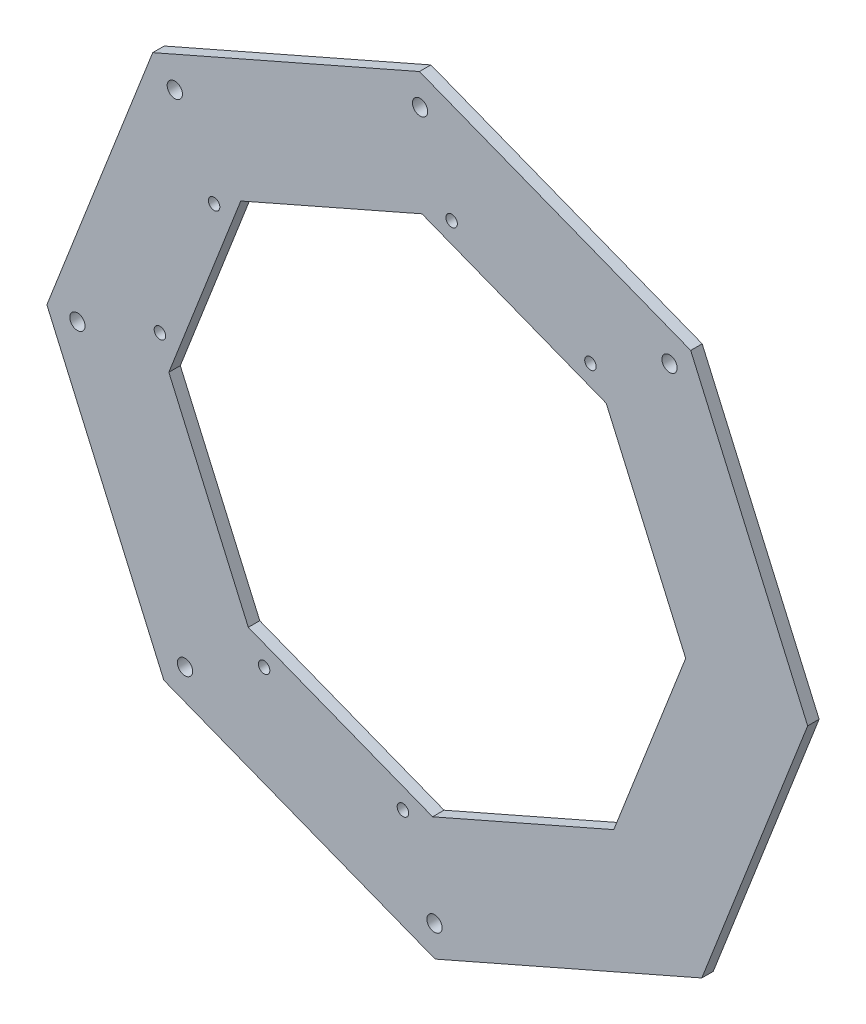
ISO-10303-21;
HEADER;
FILE_DESCRIPTION(('STEP AP214'),'2;1');
FILE_NAME('part.step','',(''),(''),'','','');
FILE_SCHEMA(('AUTOMOTIVE_DESIGN { 1 0 10303 214 1 1 1 1 }'));
ENDSEC;
DATA;
#1=APPLICATION_CONTEXT('core data for automotive mechanical design processes');
#2=APPLICATION_PROTOCOL_DEFINITION('international standard','automotive_design',2000,#1);
#3=PRODUCT_CONTEXT('',#1,'mechanical');
#4=PRODUCT('Part','Part','',(#3));
#5=PRODUCT_RELATED_PRODUCT_CATEGORY('part','',(#4));
#6=PRODUCT_DEFINITION_FORMATION('','',#4);
#7=PRODUCT_DEFINITION_CONTEXT('part definition',#1,'design');
#8=PRODUCT_DEFINITION('design','',#6,#7);
#9=PRODUCT_DEFINITION_SHAPE('','',#8);
#10=(LENGTH_UNIT() NAMED_UNIT(*) SI_UNIT(.MILLI.,.METRE.));
#11=(NAMED_UNIT(*) PLANE_ANGLE_UNIT() SI_UNIT($,.RADIAN.));
#12=(NAMED_UNIT(*) SI_UNIT($,.STERADIAN.) SOLID_ANGLE_UNIT());
#13=UNCERTAINTY_MEASURE_WITH_UNIT(LENGTH_MEASURE(1.E-05),#10,'distance_accuracy_value','');
#14=(GEOMETRIC_REPRESENTATION_CONTEXT(3) GLOBAL_UNCERTAINTY_ASSIGNED_CONTEXT((#13)) GLOBAL_UNIT_ASSIGNED_CONTEXT((#10,
#11,#12)) REPRESENTATION_CONTEXT('',''));
#15=CARTESIAN_POINT('',(0.,0.,0.));
#16=DIRECTION('',(0.,0.,1.));
#17=DIRECTION('',(1.,0.,0.));
#18=AXIS2_PLACEMENT_3D('',#15,#16,#17);
#19=CARTESIAN_POINT('',(-71.8502386018696,68.9473424361131,3.));
#20=DIRECTION('',(0.931571537654835,-0.363558069957751,0.));
#21=DIRECTION('',(0.363558069957751,0.931571537654836,0.));
#22=AXIS2_PLACEMENT_3D('',#19,#20,#21);
#23=PLANE('',#22);
#24=DIRECTION('',(-0.363558069957751,-0.931571537654835,0.));
#25=VECTOR('',#24,1.);
#26=CARTESIAN_POINT('',(-71.8502386018696,68.9473424361131,0.));
#27=LINE('',#26,#25);
#28=CARTESIAN_POINT('',(-71.8502386018696,68.9473424361131,0.));
#29=VERTEX_POINT('',#28);
#30=CARTESIAN_POINT('',(-99.5589243266201,-2.05265756388685,0.));
#31=VERTEX_POINT('',#30);
#32=EDGE_CURVE('E205',#29,#31,#27,.T.);
#33=ORIENTED_EDGE('',*,*,#32,.T.);
#34=DIRECTION('',(0.,0.,-1.));
#35=VECTOR('',#34,1.);
#36=CARTESIAN_POINT('',(-99.5589243266201,-2.05265756388685,3.));
#37=LINE('',#36,#35);
#38=CARTESIAN_POINT('',(-99.5589243266201,-2.05265756388685,3.));
#39=VERTEX_POINT('',#38);
#40=EDGE_CURVE('E11',#39,#31,#37,.T.);
#41=ORIENTED_EDGE('',*,*,#40,.F.);
#42=DIRECTION('',(-0.363558069957751,-0.931571537654835,0.));
#43=VECTOR('',#42,1.);
#44=CARTESIAN_POINT('',(-71.8502386018696,68.9473424361131,3.));
#45=LINE('',#44,#43);
#46=CARTESIAN_POINT('',(-71.8502386018696,68.9473424361131,3.));
#47=VERTEX_POINT('',#46);
#48=EDGE_CURVE('E217',#47,#39,#45,.T.);
#49=ORIENTED_EDGE('',*,*,#48,.F.);
#50=DIRECTION('',(0.,0.,-1.));
#51=VECTOR('',#50,1.);
#52=CARTESIAN_POINT('',(-71.8502386018696,68.9473424361131,3.));
#53=LINE('',#52,#51);
#54=EDGE_CURVE('E235',#47,#29,#53,.T.);
#55=ORIENTED_EDGE('',*,*,#54,.T.);
#56=EDGE_LOOP('',(#33,#41,#49,#55));
#57=FACE_BOUND('',#56,.T.);
#58=ADVANCED_FACE('F32',(#57),#23,.F.);
#59=CARTESIAN_POINT('',(-99.5589243266201,-2.05265756388685,3.));
#60=DIRECTION('',(0.915794928058333,0.401646174813894,0.));
#61=DIRECTION('',(-0.401646174813894,0.915794928058333,0.));
#62=AXIS2_PLACEMENT_3D('',#59,#60,#61);
#63=PLANE('',#62);
#64=DIRECTION('',(0.401646174813894,-0.915794928058333,0.));
#65=VECTOR('',#64,1.);
#66=CARTESIAN_POINT('',(-99.5589243266201,-2.05265756388685,0.));
#67=LINE('',#66,#65);
#68=CARTESIAN_POINT('',(-68.9473424361131,-71.8502386018696,0.));
#69=VERTEX_POINT('',#68);
#70=EDGE_CURVE('E238',#31,#69,#67,.T.);
#71=ORIENTED_EDGE('',*,*,#70,.T.);
#72=DIRECTION('',(0.,0.,-1.));
#73=VECTOR('',#72,1.);
#74=CARTESIAN_POINT('',(-68.9473424361131,-71.8502386018696,3.));
#75=LINE('',#74,#73);
#76=CARTESIAN_POINT('',(-68.9473424361131,-71.8502386018696,3.));
#77=VERTEX_POINT('',#76);
#78=EDGE_CURVE('E39',#77,#69,#75,.T.);
#79=ORIENTED_EDGE('',*,*,#78,.F.);
#80=DIRECTION('',(0.401646174813894,-0.915794928058333,0.));
#81=VECTOR('',#80,1.);
#82=CARTESIAN_POINT('',(-99.5589243266201,-2.05265756388685,3.));
#83=LINE('',#82,#81);
#84=EDGE_CURVE('E220',#39,#77,#83,.T.);
#85=ORIENTED_EDGE('',*,*,#84,.F.);
#86=ORIENTED_EDGE('',*,*,#40,.T.);
#87=EDGE_LOOP('',(#71,#79,#85,#86));
#88=FACE_BOUND('',#87,.T.);
#89=ADVANCED_FACE('F293',(#88),#63,.F.);
#90=CARTESIAN_POINT('',(-68.9473424361131,-71.8502386018696,3.));
#91=DIRECTION('',(0.363558069957751,0.931571537654836,0.));
#92=DIRECTION('',(-0.931571537654836,0.363558069957751,0.));
#93=AXIS2_PLACEMENT_3D('',#90,#91,#92);
#94=PLANE('',#93);
#95=DIRECTION('',(0.931571537654836,-0.363558069957751,0.));
#96=VECTOR('',#95,1.);
#97=CARTESIAN_POINT('',(-68.9473424361131,-71.8502386018696,0.));
#98=LINE('',#97,#96);
#99=CARTESIAN_POINT('',(2.05265756388688,-99.5589243266201,0.));
#100=VERTEX_POINT('',#99);
#101=EDGE_CURVE('E240',#69,#100,#98,.T.);
#102=ORIENTED_EDGE('',*,*,#101,.T.);
#103=DIRECTION('',(0.,0.,-1.));
#104=VECTOR('',#103,1.);
#105=CARTESIAN_POINT('',(2.05265756388688,-99.5589243266201,3.));
#106=LINE('',#105,#104);
#107=CARTESIAN_POINT('',(2.05265756388688,-99.5589243266201,3.));
#108=VERTEX_POINT('',#107);
#109=EDGE_CURVE('E265',#108,#100,#106,.T.);
#110=ORIENTED_EDGE('',*,*,#109,.F.);
#111=DIRECTION('',(0.931571537654836,-0.363558069957751,0.));
#112=VECTOR('',#111,1.);
#113=CARTESIAN_POINT('',(-68.9473424361131,-71.8502386018696,3.));
#114=LINE('',#113,#112);
#115=EDGE_CURVE('E223',#77,#108,#114,.T.);
#116=ORIENTED_EDGE('',*,*,#115,.F.);
#117=ORIENTED_EDGE('',*,*,#78,.T.);
#118=EDGE_LOOP('',(#102,#110,#116,#117));
#119=FACE_BOUND('',#118,.T.);
#120=ADVANCED_FACE('F272',(#119),#94,.F.);
#121=CARTESIAN_POINT('',(2.05265756388688,-99.5589243266201,3.));
#122=DIRECTION('',(-0.401646174813894,0.915794928058333,0.));
#123=DIRECTION('',(-0.915794928058333,-0.401646174813894,0.));
#124=AXIS2_PLACEMENT_3D('',#121,#122,#123);
#125=PLANE('',#124);
#126=DIRECTION('',(0.915794928058333,0.401646174813894,0.));
#127=VECTOR('',#126,1.);
#128=CARTESIAN_POINT('',(2.05265756388688,-99.5589243266201,0.));
#129=LINE('',#128,#127);
#130=CARTESIAN_POINT('',(71.8502386018696,-68.9473424361131,0.));
#131=VERTEX_POINT('',#130);
#132=EDGE_CURVE('E242',#100,#131,#129,.T.);
#133=ORIENTED_EDGE('',*,*,#132,.T.);
#134=DIRECTION('',(0.,0.,-1.));
#135=VECTOR('',#134,1.);
#136=CARTESIAN_POINT('',(71.8502386018696,-68.9473424361131,3.));
#137=LINE('',#136,#135);
#138=CARTESIAN_POINT('',(71.8502386018696,-68.9473424361131,3.));
#139=VERTEX_POINT('',#138);
#140=EDGE_CURVE('E262',#139,#131,#137,.T.);
#141=ORIENTED_EDGE('',*,*,#140,.F.);
#142=DIRECTION('',(0.915794928058333,0.401646174813894,0.));
#143=VECTOR('',#142,1.);
#144=CARTESIAN_POINT('',(2.05265756388688,-99.5589243266201,3.));
#145=LINE('',#144,#143);
#146=EDGE_CURVE('E225',#108,#139,#145,.T.);
#147=ORIENTED_EDGE('',*,*,#146,.F.);
#148=ORIENTED_EDGE('',*,*,#109,.T.);
#149=EDGE_LOOP('',(#133,#141,#147,#148));
#150=FACE_BOUND('',#149,.T.);
#151=ADVANCED_FACE('F281',(#150),#125,.F.);
#152=CARTESIAN_POINT('',(71.8502386018696,-68.9473424361131,3.));
#153=DIRECTION('',(-0.931571537654835,0.363558069957751,0.));
#154=DIRECTION('',(-0.363558069957752,-0.931571537654836,0.));
#155=AXIS2_PLACEMENT_3D('',#152,#153,#154);
#156=PLANE('',#155);
#157=DIRECTION('',(0.363558069957752,0.931571537654835,0.));
#158=VECTOR('',#157,1.);
#159=CARTESIAN_POINT('',(71.8502386018696,-68.9473424361131,0.));
#160=LINE('',#159,#158);
#161=CARTESIAN_POINT('',(99.55892432662,2.05265756388685,0.));
#162=VERTEX_POINT('',#161);
#163=EDGE_CURVE('E244',#131,#162,#160,.T.);
#164=ORIENTED_EDGE('',*,*,#163,.T.);
#165=DIRECTION('',(0.,0.,-1.));
#166=VECTOR('',#165,1.);
#167=CARTESIAN_POINT('',(99.55892432662,2.05265756388685,3.));
#168=LINE('',#167,#166);
#169=CARTESIAN_POINT('',(99.55892432662,2.05265756388685,3.));
#170=VERTEX_POINT('',#169);
#171=EDGE_CURVE('E259',#170,#162,#168,.T.);
#172=ORIENTED_EDGE('',*,*,#171,.F.);
#173=DIRECTION('',(0.363558069957752,0.931571537654835,0.));
#174=VECTOR('',#173,1.);
#175=CARTESIAN_POINT('',(71.8502386018696,-68.9473424361131,3.));
#176=LINE('',#175,#174);
#177=EDGE_CURVE('E227',#139,#170,#176,.T.);
#178=ORIENTED_EDGE('',*,*,#177,.F.);
#179=ORIENTED_EDGE('',*,*,#140,.T.);
#180=EDGE_LOOP('',(#164,#172,#178,#179));
#181=FACE_BOUND('',#180,.T.);
#182=ADVANCED_FACE('F285',(#181),#156,.F.);
#183=CARTESIAN_POINT('',(99.55892432662,2.05265756388685,3.));
#184=DIRECTION('',(-0.915794928058333,-0.401646174813894,0.));
#185=DIRECTION('',(0.401646174813894,-0.915794928058333,0.));
#186=AXIS2_PLACEMENT_3D('',#183,#184,#185);
#187=PLANE('',#186);
#188=DIRECTION('',(-0.401646174813894,0.915794928058333,0.));
#189=VECTOR('',#188,1.);
#190=CARTESIAN_POINT('',(99.55892432662,2.05265756388685,0.));
#191=LINE('',#190,#189);
#192=CARTESIAN_POINT('',(68.9473424361131,71.8502386018697,0.));
#193=VERTEX_POINT('',#192);
#194=EDGE_CURVE('E246',#162,#193,#191,.T.);
#195=ORIENTED_EDGE('',*,*,#194,.T.);
#196=DIRECTION('',(0.,0.,-1.));
#197=VECTOR('',#196,1.);
#198=CARTESIAN_POINT('',(68.9473424361131,71.8502386018697,3.));
#199=LINE('',#198,#197);
#200=CARTESIAN_POINT('',(68.9473424361131,71.8502386018697,3.));
#201=VERTEX_POINT('',#200);
#202=EDGE_CURVE('E256',#201,#193,#199,.T.);
#203=ORIENTED_EDGE('',*,*,#202,.F.);
#204=DIRECTION('',(-0.401646174813894,0.915794928058333,0.));
#205=VECTOR('',#204,1.);
#206=CARTESIAN_POINT('',(99.55892432662,2.05265756388685,3.));
#207=LINE('',#206,#205);
#208=EDGE_CURVE('E229',#170,#201,#207,.T.);
#209=ORIENTED_EDGE('',*,*,#208,.F.);
#210=ORIENTED_EDGE('',*,*,#171,.T.);
#211=EDGE_LOOP('',(#195,#203,#209,#210));
#212=FACE_BOUND('',#211,.T.);
#213=ADVANCED_FACE('F306',(#212),#187,.F.);
#214=CARTESIAN_POINT('',(68.9473424361131,71.8502386018697,3.));
#215=DIRECTION('',(-0.363558069957751,-0.931571537654835,0.));
#216=DIRECTION('',(0.931571537654836,-0.363558069957752,0.));
#217=AXIS2_PLACEMENT_3D('',#214,#215,#216);
#218=PLANE('',#217);
#219=DIRECTION('',(-0.931571537654835,0.363558069957752,0.));
#220=VECTOR('',#219,1.);
#221=CARTESIAN_POINT('',(68.9473424361131,71.8502386018697,0.));
#222=LINE('',#221,#220);
#223=CARTESIAN_POINT('',(-2.05265756388687,99.5589243266201,0.));
#224=VERTEX_POINT('',#223);
#225=EDGE_CURVE('E248',#193,#224,#222,.T.);
#226=ORIENTED_EDGE('',*,*,#225,.T.);
#227=DIRECTION('',(0.,0.,-1.));
#228=VECTOR('',#227,1.);
#229=CARTESIAN_POINT('',(-2.05265756388687,99.5589243266201,3.));
#230=LINE('',#229,#228);
#231=CARTESIAN_POINT('',(-2.05265756388687,99.5589243266201,3.));
#232=VERTEX_POINT('',#231);
#233=EDGE_CURVE('E253',#232,#224,#230,.T.);
#234=ORIENTED_EDGE('',*,*,#233,.F.);
#235=DIRECTION('',(-0.931571537654835,0.363558069957752,0.));
#236=VECTOR('',#235,1.);
#237=CARTESIAN_POINT('',(68.9473424361131,71.8502386018697,3.));
#238=LINE('',#237,#236);
#239=EDGE_CURVE('E231',#201,#232,#238,.T.);
#240=ORIENTED_EDGE('',*,*,#239,.F.);
#241=ORIENTED_EDGE('',*,*,#202,.T.);
#242=EDGE_LOOP('',(#226,#234,#240,#241));
#243=FACE_BOUND('',#242,.T.);
#244=ADVANCED_FACE('F304',(#243),#218,.F.);
#245=CARTESIAN_POINT('',(-2.05265756388687,99.5589243266201,3.));
#246=DIRECTION('',(0.401646174813894,-0.915794928058333,0.));
#247=DIRECTION('',(0.915794928058333,0.401646174813894,0.));
#248=AXIS2_PLACEMENT_3D('',#245,#246,#247);
#249=PLANE('',#248);
#250=DIRECTION('',(-0.915794928058333,-0.401646174813894,0.));
#251=VECTOR('',#250,1.);
#252=CARTESIAN_POINT('',(-2.05265756388687,99.5589243266201,0.));
#253=LINE('',#252,#251);
#254=EDGE_CURVE('E221',#224,#29,#253,.T.);
#255=ORIENTED_EDGE('',*,*,#254,.T.);
#256=ORIENTED_EDGE('',*,*,#54,.F.);
#257=DIRECTION('',(-0.915794928058333,-0.401646174813894,0.));
#258=VECTOR('',#257,1.);
#259=CARTESIAN_POINT('',(-2.05265756388687,99.5589243266201,3.));
#260=LINE('',#259,#258);
#261=EDGE_CURVE('E233',#232,#47,#260,.T.);
#262=ORIENTED_EDGE('',*,*,#261,.F.);
#263=ORIENTED_EDGE('',*,*,#233,.T.);
#264=EDGE_LOOP('',(#255,#256,#262,#263));
#265=FACE_BOUND('',#264,.T.);
#266=ADVANCED_FACE('F299',(#265),#249,.F.);
#267=CARTESIAN_POINT('',(0.,0.,3.));
#268=DIRECTION('',(0.,0.,1.));
#269=DIRECTION('',(1.,0.,0.));
#270=AXIS2_PLACEMENT_3D('',#267,#268,#269);
#271=PLANE('',#270);
#272=CARTESIAN_POINT('',(-66.0779807887972,63.4082956102172,3.));
#273=DIRECTION('',(0.,0.,1.));
#274=DIRECTION('',(1.,0.,0.));
#275=AXIS2_PLACEMENT_3D('',#272,#273,#274);
#276=CIRCLE('',#275,2.00000000000294);
#277=CARTESIAN_POINT('',(-64.0779807887942,63.4082956102172,3.));
#278=VERTEX_POINT('',#277);
#279=EDGE_CURVE('E574',#278,#278,#276,.T.);
#280=ORIENTED_EDGE('',*,*,#279,.F.);
#281=EDGE_LOOP('',(#280));
#282=FACE_BOUND('',#281,.T.);
#283=CARTESIAN_POINT('',(-91.5606241123375,-1.88775249340988,3.));
#284=DIRECTION('',(0.,0.,1.));
#285=DIRECTION('',(1.,0.,0.));
#286=AXIS2_PLACEMENT_3D('',#283,#284,#285);
#287=CIRCLE('',#286,2.00000000000575);
#288=CARTESIAN_POINT('',(-89.5606241123317,-1.88775249340988,3.));
#289=VERTEX_POINT('',#288);
#290=EDGE_CURVE('E576',#289,#289,#287,.T.);
#291=ORIENTED_EDGE('',*,*,#290,.F.);
#292=EDGE_LOOP('',(#291));
#293=FACE_BOUND('',#292,.T.);
#294=CARTESIAN_POINT('',(-63.4082956102132,-66.077980788801,3.));
#295=DIRECTION('',(0.,0.,1.));
#296=DIRECTION('',(1.,0.,0.));
#297=AXIS2_PLACEMENT_3D('',#294,#295,#296);
#298=CIRCLE('',#297,2.00000000000794);
#299=CARTESIAN_POINT('',(-61.4082956102053,-66.077980788801,3.));
#300=VERTEX_POINT('',#299);
#301=EDGE_CURVE('E582',#300,#300,#298,.T.);
#302=ORIENTED_EDGE('',*,*,#301,.F.);
#303=EDGE_LOOP('',(#302));
#304=FACE_BOUND('',#303,.T.);
#305=CARTESIAN_POINT('',(1.88775249341385,-91.5606241123413,3.));
#306=DIRECTION('',(0.,0.,1.));
#307=DIRECTION('',(1.,0.,0.));
#308=AXIS2_PLACEMENT_3D('',#305,#306,#307);
#309=CIRCLE('',#308,2.00000000000815);
#310=CARTESIAN_POINT('',(3.887752493422,-91.5606241123413,3.));
#311=VERTEX_POINT('',#310);
#312=EDGE_CURVE('E588',#311,#311,#309,.T.);
#313=ORIENTED_EDGE('',*,*,#312,.F.);
#314=EDGE_LOOP('',(#313));
#315=FACE_BOUND('',#314,.T.);
#316=CARTESIAN_POINT('',(63.408295610221,66.0779807888012,3.));
#317=DIRECTION('',(0.,0.,1.));
#318=DIRECTION('',(1.,0.,0.));
#319=AXIS2_PLACEMENT_3D('',#316,#317,#318);
#320=CIRCLE('',#319,2.00000000000049);
#321=CARTESIAN_POINT('',(65.4082956102215,66.0779807888012,3.));
#322=VERTEX_POINT('',#321);
#323=EDGE_CURVE('E594',#322,#322,#320,.T.);
#324=ORIENTED_EDGE('',*,*,#323,.F.);
#325=EDGE_LOOP('',(#324));
#326=FACE_BOUND('',#325,.T.);
#327=CARTESIAN_POINT('',(-1.88775249340604,91.5606241123414,3.));
#328=DIRECTION('',(0.,0.,1.));
#329=DIRECTION('',(1.,0.,0.));
#330=AXIS2_PLACEMENT_3D('',#327,#328,#329);
#331=CIRCLE('',#330,2.);
#332=CARTESIAN_POINT('',(0.112247506593964,91.5606241123414,3.));
#333=VERTEX_POINT('',#332);
#334=EDGE_CURVE('E600',#333,#333,#331,.T.);
#335=ORIENTED_EDGE('',*,*,#334,.F.);
#336=EDGE_LOOP('',(#335));
#337=FACE_BOUND('',#336,.T.);
#338=CARTESIAN_POINT('',(-55.7916964275254,42.7058147064172,3.));
#339=DIRECTION('',(0.,0.,1.));
#340=DIRECTION('',(-1.,0.,0.));
#341=AXIS2_PLACEMENT_3D('',#338,#339,#340);
#342=CIRCLE('',#341,1.5);
#343=CARTESIAN_POINT('',(-57.2916964275254,42.7058147064172,3.));
#344=VERTEX_POINT('',#343);
#345=EDGE_CURVE('E606',#344,#344,#342,.T.);
#346=ORIENTED_EDGE('',*,*,#345,.F.);
#347=EDGE_LOOP('',(#346));
#348=FACE_BOUND('',#347,.T.);
#349=CARTESIAN_POINT('',(-69.9704611558775,6.37452473787853,3.));
#350=DIRECTION('',(0.,0.,1.));
#351=DIRECTION('',(1.,0.,0.));
#352=AXIS2_PLACEMENT_3D('',#349,#350,#351);
#353=CIRCLE('',#352,1.5);
#354=CARTESIAN_POINT('',(-68.4704611558775,6.37452473787853,3.));
#355=VERTEX_POINT('',#354);
#356=EDGE_CURVE('E612',#355,#355,#353,.T.);
#357=ORIENTED_EDGE('',*,*,#356,.F.);
#358=EDGE_LOOP('',(#357));
#359=FACE_BOUND('',#358,.T.);
#360=CARTESIAN_POINT('',(-42.7058147064178,-55.791696427525,3.));
#361=DIRECTION('',(0.,0.,1.));
#362=DIRECTION('',(-1.,0.,0.));
#363=AXIS2_PLACEMENT_3D('',#360,#361,#362);
#364=CIRCLE('',#363,1.5);
#365=CARTESIAN_POINT('',(-44.2058147064178,-55.791696427525,3.));
#366=VERTEX_POINT('',#365);
#367=EDGE_CURVE('E618',#366,#366,#364,.T.);
#368=ORIENTED_EDGE('',*,*,#367,.F.);
#369=EDGE_LOOP('',(#368));
#370=FACE_BOUND('',#369,.T.);
#371=CARTESIAN_POINT('',(-6.37452473787934,-69.9704611558775,3.));
#372=DIRECTION('',(0.,0.,1.));
#373=DIRECTION('',(1.,0.,0.));
#374=AXIS2_PLACEMENT_3D('',#371,#372,#373);
#375=CIRCLE('',#374,1.5);
#376=CARTESIAN_POINT('',(-4.87452473787934,-69.9704611558775,3.));
#377=VERTEX_POINT('',#376);
#378=EDGE_CURVE('E624',#377,#377,#375,.T.);
#379=ORIENTED_EDGE('',*,*,#378,.F.);
#380=EDGE_LOOP('',(#379));
#381=FACE_BOUND('',#380,.T.);
#382=CARTESIAN_POINT('',(42.7058147064172,55.7916964275254,3.));
#383=DIRECTION('',(0.,0.,1.));
#384=DIRECTION('',(-1.,0.,0.));
#385=AXIS2_PLACEMENT_3D('',#382,#383,#384);
#386=CIRCLE('',#385,1.5);
#387=CARTESIAN_POINT('',(41.2058147064172,55.7916964275254,3.));
#388=VERTEX_POINT('',#387);
#389=EDGE_CURVE('E630',#388,#388,#386,.T.);
#390=ORIENTED_EDGE('',*,*,#389,.F.);
#391=EDGE_LOOP('',(#390));
#392=FACE_BOUND('',#391,.T.);
#393=CARTESIAN_POINT('',(6.37452473787854,69.9704611558775,3.));
#394=DIRECTION('',(0.,0.,1.));
#395=DIRECTION('',(1.,0.,0.));
#396=AXIS2_PLACEMENT_3D('',#393,#394,#395);
#397=CIRCLE('',#396,1.5);
#398=CARTESIAN_POINT('',(7.87452473787854,69.9704611558775,3.));
#399=VERTEX_POINT('',#398);
#400=EDGE_CURVE('E169',#399,#399,#397,.T.);
#401=ORIENTED_EDGE('',*,*,#400,.F.);
#402=EDGE_LOOP('',(#401));
#403=FACE_BOUND('',#402,.T.);
#404=DIRECTION('',(-0.363558069957747,-0.931571537654838,0.));
#405=VECTOR('',#404,1.);
#406=CARTESIAN_POINT('',(-48.8113033980095,46.8392271984462,3.));
#407=LINE('',#406,#405);
#408=CARTESIAN_POINT('',(-48.8113033980095,46.8392271984462,3.));
#409=VERTEX_POINT('',#408);
#410=CARTESIAN_POINT('',(-67.6351388088451,-1.39446845372782,3.));
#411=VERTEX_POINT('',#410);
#412=EDGE_CURVE('E46',#409,#411,#407,.T.);
#413=ORIENTED_EDGE('',*,*,#412,.F.);
#414=DIRECTION('',(-0.915794928058331,-0.401646174813899,0.));
#415=VECTOR('',#414,1.);
#416=CARTESIAN_POINT('',(-1.39446845372784,67.6351388088452,3.));
#417=LINE('',#416,#415);
#418=CARTESIAN_POINT('',(-1.39446845372784,67.6351388088452,3.));
#419=VERTEX_POINT('',#418);
#420=EDGE_CURVE('E163',#419,#409,#417,.T.);
#421=ORIENTED_EDGE('',*,*,#420,.F.);
#422=DIRECTION('',(-0.931571537654837,0.363558069957747,0.));
#423=VECTOR('',#422,1.);
#424=CARTESIAN_POINT('',(46.8392271984462,48.8113033980095,3.));
#425=LINE('',#424,#423);
#426=CARTESIAN_POINT('',(46.8392271984462,48.8113033980095,3.));
#427=VERTEX_POINT('',#426);
#428=EDGE_CURVE('E166',#427,#419,#425,.T.);
#429=ORIENTED_EDGE('',*,*,#428,.F.);
#430=DIRECTION('',(-0.401646174813899,0.915794928058331,0.));
#431=VECTOR('',#430,1.);
#432=CARTESIAN_POINT('',(67.6351388088451,1.39446845372784,3.));
#433=LINE('',#432,#431);
#434=CARTESIAN_POINT('',(67.6351388088451,1.39446845372784,3.));
#435=VERTEX_POINT('',#434);
#436=EDGE_CURVE('E198',#435,#427,#433,.T.);
#437=ORIENTED_EDGE('',*,*,#436,.F.);
#438=DIRECTION('',(0.363558069957747,0.931571537654838,0.));
#439=VECTOR('',#438,1.);
#440=CARTESIAN_POINT('',(48.8113033980095,-46.8392271984462,3.));
#441=LINE('',#440,#439);
#442=CARTESIAN_POINT('',(48.8113033980095,-46.8392271984462,3.));
#443=VERTEX_POINT('',#442);
#444=EDGE_CURVE('E195',#443,#435,#441,.T.);
#445=ORIENTED_EDGE('',*,*,#444,.F.);
#446=DIRECTION('',(0.915794928058331,0.401646174813898,0.));
#447=VECTOR('',#446,1.);
#448=CARTESIAN_POINT('',(1.39446845372784,-67.6351388088451,3.));
#449=LINE('',#448,#447);
#450=CARTESIAN_POINT('',(1.39446845372784,-67.6351388088451,3.));
#451=VERTEX_POINT('',#450);
#452=EDGE_CURVE('E192',#451,#443,#449,.T.);
#453=ORIENTED_EDGE('',*,*,#452,.F.);
#454=DIRECTION('',(0.931571537654837,-0.363558069957747,0.));
#455=VECTOR('',#454,1.);
#456=CARTESIAN_POINT('',(-46.8392271984462,-48.8113033980095,3.));
#457=LINE('',#456,#455);
#458=CARTESIAN_POINT('',(-46.8392271984462,-48.8113033980095,3.));
#459=VERTEX_POINT('',#458);
#460=EDGE_CURVE('E189',#459,#451,#457,.T.);
#461=ORIENTED_EDGE('',*,*,#460,.F.);
#462=DIRECTION('',(0.401646174813898,-0.915794928058331,0.));
#463=VECTOR('',#462,1.);
#464=CARTESIAN_POINT('',(-67.6351388088451,-1.39446845372782,3.));
#465=LINE('',#464,#463);
#466=EDGE_CURVE('E186',#411,#459,#465,.T.);
#467=ORIENTED_EDGE('',*,*,#466,.F.);
#468=EDGE_LOOP('',(#413,#421,#429,#437,#445,#453,#461,#467));
#469=FACE_BOUND('',#468,.T.);
#470=ORIENTED_EDGE('',*,*,#48,.T.);
#471=ORIENTED_EDGE('',*,*,#84,.T.);
#472=ORIENTED_EDGE('',*,*,#115,.T.);
#473=ORIENTED_EDGE('',*,*,#146,.T.);
#474=ORIENTED_EDGE('',*,*,#177,.T.);
#475=ORIENTED_EDGE('',*,*,#208,.T.);
#476=ORIENTED_EDGE('',*,*,#239,.T.);
#477=ORIENTED_EDGE('',*,*,#261,.T.);
#478=EDGE_LOOP('',(#470,#471,#472,#473,#474,#475,#476,#477));
#479=FACE_BOUND('',#478,.T.);
#480=ADVANCED_FACE('F289',(#282,#293,#304,#315,#326,#337,#348,#359,#370,#381,#392,#403,#469,
#479),#271,.T.);
#481=CARTESIAN_POINT('',(0.,0.,0.));
#482=DIRECTION('',(0.,0.,1.));
#483=DIRECTION('',(1.,0.,0.));
#484=AXIS2_PLACEMENT_3D('',#481,#482,#483);
#485=PLANE('',#484);
#486=CARTESIAN_POINT('',(-66.0779807887972,63.4082956102172,0.));
#487=DIRECTION('',(0.,0.,1.));
#488=DIRECTION('',(1.,0.,0.));
#489=AXIS2_PLACEMENT_3D('',#486,#487,#488);
#490=CIRCLE('',#489,2.00000000000294);
#491=CARTESIAN_POINT('',(-64.0779807887942,63.4082956102172,0.));
#492=VERTEX_POINT('',#491);
#493=EDGE_CURVE('E571',#492,#492,#490,.T.);
#494=ORIENTED_EDGE('',*,*,#493,.T.);
#495=EDGE_LOOP('',(#494));
#496=FACE_BOUND('',#495,.T.);
#497=CARTESIAN_POINT('',(-91.5606241123375,-1.88775249340988,0.));
#498=DIRECTION('',(0.,0.,1.));
#499=DIRECTION('',(1.,0.,0.));
#500=AXIS2_PLACEMENT_3D('',#497,#498,#499);
#501=CIRCLE('',#500,2.00000000000575);
#502=CARTESIAN_POINT('',(-89.5606241123317,-1.88775249340988,0.));
#503=VERTEX_POINT('',#502);
#504=EDGE_CURVE('E579',#503,#503,#501,.T.);
#505=ORIENTED_EDGE('',*,*,#504,.T.);
#506=EDGE_LOOP('',(#505));
#507=FACE_BOUND('',#506,.T.);
#508=CARTESIAN_POINT('',(-63.4082956102132,-66.077980788801,0.));
#509=DIRECTION('',(0.,0.,1.));
#510=DIRECTION('',(1.,0.,0.));
#511=AXIS2_PLACEMENT_3D('',#508,#509,#510);
#512=CIRCLE('',#511,2.00000000000794);
#513=CARTESIAN_POINT('',(-61.4082956102053,-66.077980788801,0.));
#514=VERTEX_POINT('',#513);
#515=EDGE_CURVE('E585',#514,#514,#512,.T.);
#516=ORIENTED_EDGE('',*,*,#515,.T.);
#517=EDGE_LOOP('',(#516));
#518=FACE_BOUND('',#517,.T.);
#519=CARTESIAN_POINT('',(1.88775249341385,-91.5606241123413,0.));
#520=DIRECTION('',(0.,0.,1.));
#521=DIRECTION('',(1.,0.,0.));
#522=AXIS2_PLACEMENT_3D('',#519,#520,#521);
#523=CIRCLE('',#522,2.00000000000815);
#524=CARTESIAN_POINT('',(3.887752493422,-91.5606241123413,0.));
#525=VERTEX_POINT('',#524);
#526=EDGE_CURVE('E591',#525,#525,#523,.T.);
#527=ORIENTED_EDGE('',*,*,#526,.T.);
#528=EDGE_LOOP('',(#527));
#529=FACE_BOUND('',#528,.T.);
#530=CARTESIAN_POINT('',(63.408295610221,66.0779807888012,0.));
#531=DIRECTION('',(0.,0.,1.));
#532=DIRECTION('',(1.,0.,0.));
#533=AXIS2_PLACEMENT_3D('',#530,#531,#532);
#534=CIRCLE('',#533,2.00000000000049);
#535=CARTESIAN_POINT('',(65.4082956102215,66.0779807888012,0.));
#536=VERTEX_POINT('',#535);
#537=EDGE_CURVE('E597',#536,#536,#534,.T.);
#538=ORIENTED_EDGE('',*,*,#537,.T.);
#539=EDGE_LOOP('',(#538));
#540=FACE_BOUND('',#539,.T.);
#541=CARTESIAN_POINT('',(-1.88775249340604,91.5606241123414,0.));
#542=DIRECTION('',(0.,0.,1.));
#543=DIRECTION('',(1.,0.,0.));
#544=AXIS2_PLACEMENT_3D('',#541,#542,#543);
#545=CIRCLE('',#544,2.);
#546=CARTESIAN_POINT('',(0.112247506593964,91.5606241123414,0.));
#547=VERTEX_POINT('',#546);
#548=EDGE_CURVE('E603',#547,#547,#545,.T.);
#549=ORIENTED_EDGE('',*,*,#548,.T.);
#550=EDGE_LOOP('',(#549));
#551=FACE_BOUND('',#550,.T.);
#552=CARTESIAN_POINT('',(-55.7916964275254,42.7058147064172,0.));
#553=DIRECTION('',(0.,0.,1.));
#554=DIRECTION('',(-1.,0.,0.));
#555=AXIS2_PLACEMENT_3D('',#552,#553,#554);
#556=CIRCLE('',#555,1.5);
#557=CARTESIAN_POINT('',(-57.2916964275254,42.7058147064172,0.));
#558=VERTEX_POINT('',#557);
#559=EDGE_CURVE('E609',#558,#558,#556,.T.);
#560=ORIENTED_EDGE('',*,*,#559,.T.);
#561=EDGE_LOOP('',(#560));
#562=FACE_BOUND('',#561,.T.);
#563=CARTESIAN_POINT('',(-69.9704611558775,6.37452473787853,0.));
#564=DIRECTION('',(0.,0.,1.));
#565=DIRECTION('',(1.,0.,0.));
#566=AXIS2_PLACEMENT_3D('',#563,#564,#565);
#567=CIRCLE('',#566,1.5);
#568=CARTESIAN_POINT('',(-68.4704611558775,6.37452473787853,0.));
#569=VERTEX_POINT('',#568);
#570=EDGE_CURVE('E615',#569,#569,#567,.T.);
#571=ORIENTED_EDGE('',*,*,#570,.T.);
#572=EDGE_LOOP('',(#571));
#573=FACE_BOUND('',#572,.T.);
#574=CARTESIAN_POINT('',(-42.7058147064178,-55.791696427525,0.));
#575=DIRECTION('',(0.,0.,1.));
#576=DIRECTION('',(-1.,0.,0.));
#577=AXIS2_PLACEMENT_3D('',#574,#575,#576);
#578=CIRCLE('',#577,1.5);
#579=CARTESIAN_POINT('',(-44.2058147064178,-55.791696427525,0.));
#580=VERTEX_POINT('',#579);
#581=EDGE_CURVE('E621',#580,#580,#578,.T.);
#582=ORIENTED_EDGE('',*,*,#581,.T.);
#583=EDGE_LOOP('',(#582));
#584=FACE_BOUND('',#583,.T.);
#585=CARTESIAN_POINT('',(-6.37452473787934,-69.9704611558775,0.));
#586=DIRECTION('',(0.,0.,1.));
#587=DIRECTION('',(1.,0.,0.));
#588=AXIS2_PLACEMENT_3D('',#585,#586,#587);
#589=CIRCLE('',#588,1.5);
#590=CARTESIAN_POINT('',(-4.87452473787934,-69.9704611558775,0.));
#591=VERTEX_POINT('',#590);
#592=EDGE_CURVE('E627',#591,#591,#589,.T.);
#593=ORIENTED_EDGE('',*,*,#592,.T.);
#594=EDGE_LOOP('',(#593));
#595=FACE_BOUND('',#594,.T.);
#596=CARTESIAN_POINT('',(42.7058147064172,55.7916964275254,0.));
#597=DIRECTION('',(0.,0.,1.));
#598=DIRECTION('',(-1.,0.,0.));
#599=AXIS2_PLACEMENT_3D('',#596,#597,#598);
#600=CIRCLE('',#599,1.5);
#601=CARTESIAN_POINT('',(41.2058147064172,55.7916964275254,0.));
#602=VERTEX_POINT('',#601);
#603=EDGE_CURVE('E633',#602,#602,#600,.T.);
#604=ORIENTED_EDGE('',*,*,#603,.T.);
#605=EDGE_LOOP('',(#604));
#606=FACE_BOUND('',#605,.T.);
#607=CARTESIAN_POINT('',(6.37452473787854,69.9704611558775,0.));
#608=DIRECTION('',(0.,0.,1.));
#609=DIRECTION('',(1.,0.,0.));
#610=AXIS2_PLACEMENT_3D('',#607,#608,#609);
#611=CIRCLE('',#610,1.5);
#612=CARTESIAN_POINT('',(7.87452473787854,69.9704611558775,0.));
#613=VERTEX_POINT('',#612);
#614=EDGE_CURVE('E187',#613,#613,#611,.T.);
#615=ORIENTED_EDGE('',*,*,#614,.T.);
#616=EDGE_LOOP('',(#615));
#617=FACE_BOUND('',#616,.T.);
#618=DIRECTION('',(-0.915794928058331,-0.401646174813899,0.));
#619=VECTOR('',#618,1.);
#620=CARTESIAN_POINT('',(-1.39446845372784,67.6351388088452,0.));
#621=LINE('',#620,#619);
#622=CARTESIAN_POINT('',(-1.39446845372784,67.6351388088452,0.));
#623=VERTEX_POINT('',#622);
#624=CARTESIAN_POINT('',(-48.8113033980095,46.8392271984462,0.));
#625=VERTEX_POINT('',#624);
#626=EDGE_CURVE('E152',#623,#625,#621,.T.);
#627=ORIENTED_EDGE('',*,*,#626,.T.);
#628=DIRECTION('',(-0.363558069957747,-0.931571537654838,0.));
#629=VECTOR('',#628,1.);
#630=CARTESIAN_POINT('',(-48.8113033980095,46.8392271984462,0.));
#631=LINE('',#630,#629);
#632=CARTESIAN_POINT('',(-67.6351388088451,-1.39446845372782,0.));
#633=VERTEX_POINT('',#632);
#634=EDGE_CURVE('E146',#625,#633,#631,.T.);
#635=ORIENTED_EDGE('',*,*,#634,.T.);
#636=DIRECTION('',(0.401646174813898,-0.915794928058331,0.));
#637=VECTOR('',#636,1.);
#638=CARTESIAN_POINT('',(-67.6351388088451,-1.39446845372782,0.));
#639=LINE('',#638,#637);
#640=CARTESIAN_POINT('',(-46.8392271984462,-48.8113033980095,0.));
#641=VERTEX_POINT('',#640);
#642=EDGE_CURVE('E155',#633,#641,#639,.T.);
#643=ORIENTED_EDGE('',*,*,#642,.T.);
#644=DIRECTION('',(0.931571537654837,-0.363558069957747,0.));
#645=VECTOR('',#644,1.);
#646=CARTESIAN_POINT('',(-46.8392271984462,-48.8113033980095,0.));
#647=LINE('',#646,#645);
#648=CARTESIAN_POINT('',(1.39446845372784,-67.6351388088451,0.));
#649=VERTEX_POINT('',#648);
#650=EDGE_CURVE('E54',#641,#649,#647,.T.);
#651=ORIENTED_EDGE('',*,*,#650,.T.);
#652=DIRECTION('',(0.915794928058331,0.401646174813898,0.));
#653=VECTOR('',#652,1.);
#654=CARTESIAN_POINT('',(1.39446845372784,-67.6351388088451,0.));
#655=LINE('',#654,#653);
#656=CARTESIAN_POINT('',(48.8113033980095,-46.8392271984462,0.));
#657=VERTEX_POINT('',#656);
#658=EDGE_CURVE('E173',#649,#657,#655,.T.);
#659=ORIENTED_EDGE('',*,*,#658,.T.);
#660=DIRECTION('',(0.363558069957747,0.931571537654838,0.));
#661=VECTOR('',#660,1.);
#662=CARTESIAN_POINT('',(48.8113033980095,-46.8392271984462,0.));
#663=LINE('',#662,#661);
#664=CARTESIAN_POINT('',(67.6351388088451,1.39446845372784,0.));
#665=VERTEX_POINT('',#664);
#666=EDGE_CURVE('E176',#657,#665,#663,.T.);
#667=ORIENTED_EDGE('',*,*,#666,.T.);
#668=DIRECTION('',(-0.401646174813899,0.915794928058331,0.));
#669=VECTOR('',#668,1.);
#670=CARTESIAN_POINT('',(67.6351388088451,1.39446845372784,0.));
#671=LINE('',#670,#669);
#672=CARTESIAN_POINT('',(46.8392271984462,48.8113033980095,0.));
#673=VERTEX_POINT('',#672);
#674=EDGE_CURVE('E179',#665,#673,#671,.T.);
#675=ORIENTED_EDGE('',*,*,#674,.T.);
#676=DIRECTION('',(-0.931571537654837,0.363558069957747,0.));
#677=VECTOR('',#676,1.);
#678=CARTESIAN_POINT('',(46.8392271984462,48.8113033980095,0.));
#679=LINE('',#678,#677);
#680=EDGE_CURVE('E182',#673,#623,#679,.T.);
#681=ORIENTED_EDGE('',*,*,#680,.T.);
#682=EDGE_LOOP('',(#627,#635,#643,#651,#659,#667,#675,#681));
#683=FACE_BOUND('',#682,.T.);
#684=ORIENTED_EDGE('',*,*,#32,.F.);
#685=ORIENTED_EDGE('',*,*,#254,.F.);
#686=ORIENTED_EDGE('',*,*,#225,.F.);
#687=ORIENTED_EDGE('',*,*,#194,.F.);
#688=ORIENTED_EDGE('',*,*,#163,.F.);
#689=ORIENTED_EDGE('',*,*,#132,.F.);
#690=ORIENTED_EDGE('',*,*,#101,.F.);
#691=ORIENTED_EDGE('',*,*,#70,.F.);
#692=EDGE_LOOP('',(#684,#685,#686,#687,#688,#689,#690,#691));
#693=FACE_BOUND('',#692,.T.);
#694=ADVANCED_FACE('F159',(#496,#507,#518,#529,#540,#551,#562,#573,#584,#595,#606,#617,#683,
#693),#485,.F.);
#695=CARTESIAN_POINT('',(-48.8113033980095,46.8392271984462,0.));
#696=DIRECTION('',(-0.931571537654837,0.363558069957746,0.));
#697=DIRECTION('',(-0.363558069957747,-0.931571537654838,0.));
#698=AXIS2_PLACEMENT_3D('',#695,#696,#697);
#699=PLANE('',#698);
#700=ORIENTED_EDGE('',*,*,#412,.T.);
#701=DIRECTION('',(0.,0.,1.));
#702=VECTOR('',#701,1.);
#703=CARTESIAN_POINT('',(-67.6351388088451,-1.39446845372782,0.));
#704=LINE('',#703,#702);
#705=EDGE_CURVE('E142',#633,#411,#704,.T.);
#706=ORIENTED_EDGE('',*,*,#705,.F.);
#707=ORIENTED_EDGE('',*,*,#634,.F.);
#708=DIRECTION('',(0.,0.,1.));
#709=VECTOR('',#708,1.);
#710=CARTESIAN_POINT('',(-48.8113033980095,46.8392271984462,0.));
#711=LINE('',#710,#709);
#712=EDGE_CURVE('E203',#625,#409,#711,.T.);
#713=ORIENTED_EDGE('',*,*,#712,.T.);
#714=EDGE_LOOP('',(#700,#706,#707,#713));
#715=FACE_BOUND('',#714,.T.);
#716=ADVANCED_FACE('F144',(#715),#699,.F.);
#717=CARTESIAN_POINT('',(-1.39446845372784,67.6351388088452,0.));
#718=DIRECTION('',(-0.401646174813899,0.915794928058331,0.));
#719=DIRECTION('',(-0.915794928058331,-0.401646174813899,0.));
#720=AXIS2_PLACEMENT_3D('',#717,#718,#719);
#721=PLANE('',#720);
#722=ORIENTED_EDGE('',*,*,#420,.T.);
#723=ORIENTED_EDGE('',*,*,#712,.F.);
#724=ORIENTED_EDGE('',*,*,#626,.F.);
#725=DIRECTION('',(0.,0.,1.));
#726=VECTOR('',#725,1.);
#727=CARTESIAN_POINT('',(-1.39446845372784,67.6351388088452,0.));
#728=LINE('',#727,#726);
#729=EDGE_CURVE('E206',#623,#419,#728,.T.);
#730=ORIENTED_EDGE('',*,*,#729,.T.);
#731=EDGE_LOOP('',(#722,#723,#724,#730));
#732=FACE_BOUND('',#731,.T.);
#733=ADVANCED_FACE('F362',(#732),#721,.F.);
#734=CARTESIAN_POINT('',(46.8392271984462,48.8113033980095,0.));
#735=DIRECTION('',(0.363558069957747,0.931571537654837,0.));
#736=DIRECTION('',(-0.931571537654837,0.363558069957747,0.));
#737=AXIS2_PLACEMENT_3D('',#734,#735,#736);
#738=PLANE('',#737);
#739=ORIENTED_EDGE('',*,*,#428,.T.);
#740=ORIENTED_EDGE('',*,*,#729,.F.);
#741=ORIENTED_EDGE('',*,*,#680,.F.);
#742=DIRECTION('',(0.,0.,1.));
#743=VECTOR('',#742,1.);
#744=CARTESIAN_POINT('',(46.8392271984462,48.8113033980095,0.));
#745=LINE('',#744,#743);
#746=EDGE_CURVE('E208',#673,#427,#745,.T.);
#747=ORIENTED_EDGE('',*,*,#746,.T.);
#748=EDGE_LOOP('',(#739,#740,#741,#747));
#749=FACE_BOUND('',#748,.T.);
#750=ADVANCED_FACE('F373',(#749),#738,.F.);
#751=CARTESIAN_POINT('',(67.6351388088451,1.39446845372784,0.));
#752=DIRECTION('',(0.915794928058331,0.401646174813899,0.));
#753=DIRECTION('',(-0.401646174813899,0.915794928058331,0.));
#754=AXIS2_PLACEMENT_3D('',#751,#752,#753);
#755=PLANE('',#754);
#756=ORIENTED_EDGE('',*,*,#436,.T.);
#757=ORIENTED_EDGE('',*,*,#746,.F.);
#758=ORIENTED_EDGE('',*,*,#674,.F.);
#759=DIRECTION('',(0.,0.,1.));
#760=VECTOR('',#759,1.);
#761=CARTESIAN_POINT('',(67.6351388088451,1.39446845372784,0.));
#762=LINE('',#761,#760);
#763=EDGE_CURVE('E210',#665,#435,#762,.T.);
#764=ORIENTED_EDGE('',*,*,#763,.T.);
#765=EDGE_LOOP('',(#756,#757,#758,#764));
#766=FACE_BOUND('',#765,.T.);
#767=ADVANCED_FACE('F383',(#766),#755,.F.);
#768=CARTESIAN_POINT('',(48.8113033980095,-46.8392271984462,0.));
#769=DIRECTION('',(0.931571537654837,-0.363558069957746,0.));
#770=DIRECTION('',(0.363558069957747,0.931571537654838,0.));
#771=AXIS2_PLACEMENT_3D('',#768,#769,#770);
#772=PLANE('',#771);
#773=ORIENTED_EDGE('',*,*,#444,.T.);
#774=ORIENTED_EDGE('',*,*,#763,.F.);
#775=ORIENTED_EDGE('',*,*,#666,.F.);
#776=DIRECTION('',(0.,0.,1.));
#777=VECTOR('',#776,1.);
#778=CARTESIAN_POINT('',(48.8113033980095,-46.8392271984462,0.));
#779=LINE('',#778,#777);
#780=EDGE_CURVE('E212',#657,#443,#779,.T.);
#781=ORIENTED_EDGE('',*,*,#780,.T.);
#782=EDGE_LOOP('',(#773,#774,#775,#781));
#783=FACE_BOUND('',#782,.T.);
#784=ADVANCED_FACE('F393',(#783),#772,.F.);
#785=CARTESIAN_POINT('',(1.39446845372784,-67.6351388088451,0.));
#786=DIRECTION('',(0.401646174813899,-0.915794928058331,0.));
#787=DIRECTION('',(0.915794928058331,0.401646174813899,0.));
#788=AXIS2_PLACEMENT_3D('',#785,#786,#787);
#789=PLANE('',#788);
#790=ORIENTED_EDGE('',*,*,#452,.T.);
#791=ORIENTED_EDGE('',*,*,#780,.F.);
#792=ORIENTED_EDGE('',*,*,#658,.F.);
#793=DIRECTION('',(0.,0.,1.));
#794=VECTOR('',#793,1.);
#795=CARTESIAN_POINT('',(1.39446845372784,-67.6351388088451,0.));
#796=LINE('',#795,#794);
#797=EDGE_CURVE('E214',#649,#451,#796,.T.);
#798=ORIENTED_EDGE('',*,*,#797,.T.);
#799=EDGE_LOOP('',(#790,#791,#792,#798));
#800=FACE_BOUND('',#799,.T.);
#801=ADVANCED_FACE('F403',(#800),#789,.F.);
#802=CARTESIAN_POINT('',(-46.8392271984462,-48.8113033980095,0.));
#803=DIRECTION('',(-0.363558069957747,-0.931571537654837,0.));
#804=DIRECTION('',(0.931571537654838,-0.363558069957747,0.));
#805=AXIS2_PLACEMENT_3D('',#802,#803,#804);
#806=PLANE('',#805);
#807=ORIENTED_EDGE('',*,*,#460,.T.);
#808=ORIENTED_EDGE('',*,*,#797,.F.);
#809=ORIENTED_EDGE('',*,*,#650,.F.);
#810=DIRECTION('',(0.,0.,1.));
#811=VECTOR('',#810,1.);
#812=CARTESIAN_POINT('',(-46.8392271984462,-48.8113033980095,0.));
#813=LINE('',#812,#811);
#814=EDGE_CURVE('E151',#641,#459,#813,.T.);
#815=ORIENTED_EDGE('',*,*,#814,.T.);
#816=EDGE_LOOP('',(#807,#808,#809,#815));
#817=FACE_BOUND('',#816,.T.);
#818=ADVANCED_FACE('F413',(#817),#806,.F.);
#819=CARTESIAN_POINT('',(-67.6351388088451,-1.39446845372782,0.));
#820=DIRECTION('',(-0.915794928058331,-0.401646174813898,0.));
#821=DIRECTION('',(0.401646174813898,-0.915794928058331,0.));
#822=AXIS2_PLACEMENT_3D('',#819,#820,#821);
#823=PLANE('',#822);
#824=ORIENTED_EDGE('',*,*,#466,.T.);
#825=ORIENTED_EDGE('',*,*,#814,.F.);
#826=ORIENTED_EDGE('',*,*,#642,.F.);
#827=ORIENTED_EDGE('',*,*,#705,.T.);
#828=EDGE_LOOP('',(#824,#825,#826,#827));
#829=FACE_BOUND('',#828,.T.);
#830=ADVANCED_FACE('F156',(#829),#823,.F.);
#831=CARTESIAN_POINT('',(6.37452473787854,69.9704611558775,0.));
#832=DIRECTION('',(0.,0.,1.));
#833=DIRECTION('',(1.,0.,0.));
#834=AXIS2_PLACEMENT_3D('',#831,#832,#833);
#835=CYLINDRICAL_SURFACE('',#834,1.5);
#836=ORIENTED_EDGE('',*,*,#614,.F.);
#837=EDGE_LOOP('',(#836));
#838=FACE_BOUND('',#837,.T.);
#839=ORIENTED_EDGE('',*,*,#400,.T.);
#840=EDGE_LOOP('',(#839));
#841=FACE_BOUND('',#840,.T.);
#842=ADVANCED_FACE('F431',(#838,#841),#835,.F.);
#843=CARTESIAN_POINT('',(42.7058147064172,55.7916964275254,0.));
#844=DIRECTION('',(0.,0.,1.));
#845=DIRECTION('',(1.,0.,0.));
#846=AXIS2_PLACEMENT_3D('',#843,#844,#845);
#847=CYLINDRICAL_SURFACE('',#846,1.5);
#848=ORIENTED_EDGE('',*,*,#603,.F.);
#849=EDGE_LOOP('',(#848));
#850=FACE_BOUND('',#849,.T.);
#851=ORIENTED_EDGE('',*,*,#389,.T.);
#852=EDGE_LOOP('',(#851));
#853=FACE_BOUND('',#852,.T.);
#854=ADVANCED_FACE('F440',(#850,#853),#847,.F.);
#855=CARTESIAN_POINT('',(-6.37452473787934,-69.9704611558775,0.));
#856=DIRECTION('',(0.,0.,1.));
#857=DIRECTION('',(1.,0.,0.));
#858=AXIS2_PLACEMENT_3D('',#855,#856,#857);
#859=CYLINDRICAL_SURFACE('',#858,1.5);
#860=ORIENTED_EDGE('',*,*,#592,.F.);
#861=EDGE_LOOP('',(#860));
#862=FACE_BOUND('',#861,.T.);
#863=ORIENTED_EDGE('',*,*,#378,.T.);
#864=EDGE_LOOP('',(#863));
#865=FACE_BOUND('',#864,.T.);
#866=ADVANCED_FACE('F450',(#862,#865),#859,.F.);
#867=CARTESIAN_POINT('',(-42.7058147064178,-55.791696427525,0.));
#868=DIRECTION('',(0.,0.,1.));
#869=DIRECTION('',(1.,0.,0.));
#870=AXIS2_PLACEMENT_3D('',#867,#868,#869);
#871=CYLINDRICAL_SURFACE('',#870,1.5);
#872=ORIENTED_EDGE('',*,*,#581,.F.);
#873=EDGE_LOOP('',(#872));
#874=FACE_BOUND('',#873,.T.);
#875=ORIENTED_EDGE('',*,*,#367,.T.);
#876=EDGE_LOOP('',(#875));
#877=FACE_BOUND('',#876,.T.);
#878=ADVANCED_FACE('F460',(#874,#877),#871,.F.);
#879=CARTESIAN_POINT('',(-69.9704611558775,6.37452473787853,0.));
#880=DIRECTION('',(0.,0.,1.));
#881=DIRECTION('',(1.,0.,0.));
#882=AXIS2_PLACEMENT_3D('',#879,#880,#881);
#883=CYLINDRICAL_SURFACE('',#882,1.5);
#884=ORIENTED_EDGE('',*,*,#570,.F.);
#885=EDGE_LOOP('',(#884));
#886=FACE_BOUND('',#885,.T.);
#887=ORIENTED_EDGE('',*,*,#356,.T.);
#888=EDGE_LOOP('',(#887));
#889=FACE_BOUND('',#888,.T.);
#890=ADVANCED_FACE('F470',(#886,#889),#883,.F.);
#891=CARTESIAN_POINT('',(-55.7916964275254,42.7058147064172,0.));
#892=DIRECTION('',(0.,0.,1.));
#893=DIRECTION('',(1.,0.,0.));
#894=AXIS2_PLACEMENT_3D('',#891,#892,#893);
#895=CYLINDRICAL_SURFACE('',#894,1.5);
#896=ORIENTED_EDGE('',*,*,#559,.F.);
#897=EDGE_LOOP('',(#896));
#898=FACE_BOUND('',#897,.T.);
#899=ORIENTED_EDGE('',*,*,#345,.T.);
#900=EDGE_LOOP('',(#899));
#901=FACE_BOUND('',#900,.T.);
#902=ADVANCED_FACE('F480',(#898,#901),#895,.F.);
#903=CARTESIAN_POINT('',(-1.88775249340604,91.5606241123414,0.));
#904=DIRECTION('',(0.,0.,1.));
#905=DIRECTION('',(1.,0.,0.));
#906=AXIS2_PLACEMENT_3D('',#903,#904,#905);
#907=CYLINDRICAL_SURFACE('',#906,2.);
#908=ORIENTED_EDGE('',*,*,#548,.F.);
#909=EDGE_LOOP('',(#908));
#910=FACE_BOUND('',#909,.T.);
#911=ORIENTED_EDGE('',*,*,#334,.T.);
#912=EDGE_LOOP('',(#911));
#913=FACE_BOUND('',#912,.T.);
#914=ADVANCED_FACE('F490',(#910,#913),#907,.F.);
#915=CARTESIAN_POINT('',(63.408295610221,66.0779807888012,0.));
#916=DIRECTION('',(0.,0.,1.));
#917=DIRECTION('',(1.,0.,0.));
#918=AXIS2_PLACEMENT_3D('',#915,#916,#917);
#919=CYLINDRICAL_SURFACE('',#918,2.00000000000049);
#920=ORIENTED_EDGE('',*,*,#537,.F.);
#921=EDGE_LOOP('',(#920));
#922=FACE_BOUND('',#921,.T.);
#923=ORIENTED_EDGE('',*,*,#323,.T.);
#924=EDGE_LOOP('',(#923));
#925=FACE_BOUND('',#924,.T.);
#926=ADVANCED_FACE('F514',(#922,#925),#919,.F.);
#927=CARTESIAN_POINT('',(1.88775249341385,-91.5606241123413,0.));
#928=DIRECTION('',(0.,0.,1.));
#929=DIRECTION('',(1.,0.,0.));
#930=AXIS2_PLACEMENT_3D('',#927,#928,#929);
#931=CYLINDRICAL_SURFACE('',#930,2.00000000000815);
#932=ORIENTED_EDGE('',*,*,#526,.F.);
#933=EDGE_LOOP('',(#932));
#934=FACE_BOUND('',#933,.T.);
#935=ORIENTED_EDGE('',*,*,#312,.T.);
#936=EDGE_LOOP('',(#935));
#937=FACE_BOUND('',#936,.T.);
#938=ADVANCED_FACE('F524',(#934,#937),#931,.F.);
#939=CARTESIAN_POINT('',(-63.4082956102132,-66.077980788801,0.));
#940=DIRECTION('',(0.,0.,1.));
#941=DIRECTION('',(1.,0.,0.));
#942=AXIS2_PLACEMENT_3D('',#939,#940,#941);
#943=CYLINDRICAL_SURFACE('',#942,2.00000000000794);
#944=ORIENTED_EDGE('',*,*,#515,.F.);
#945=EDGE_LOOP('',(#944));
#946=FACE_BOUND('',#945,.T.);
#947=ORIENTED_EDGE('',*,*,#301,.T.);
#948=EDGE_LOOP('',(#947));
#949=FACE_BOUND('',#948,.T.);
#950=ADVANCED_FACE('F534',(#946,#949),#943,.F.);
#951=CARTESIAN_POINT('',(-91.5606241123375,-1.88775249340988,0.));
#952=DIRECTION('',(0.,0.,1.));
#953=DIRECTION('',(1.,0.,0.));
#954=AXIS2_PLACEMENT_3D('',#951,#952,#953);
#955=CYLINDRICAL_SURFACE('',#954,2.00000000000575);
#956=ORIENTED_EDGE('',*,*,#504,.F.);
#957=EDGE_LOOP('',(#956));
#958=FACE_BOUND('',#957,.T.);
#959=ORIENTED_EDGE('',*,*,#290,.T.);
#960=EDGE_LOOP('',(#959));
#961=FACE_BOUND('',#960,.T.);
#962=ADVANCED_FACE('F544',(#958,#961),#955,.F.);
#963=CARTESIAN_POINT('',(-66.0779807887972,63.4082956102172,0.));
#964=DIRECTION('',(0.,0.,1.));
#965=DIRECTION('',(1.,0.,0.));
#966=AXIS2_PLACEMENT_3D('',#963,#964,#965);
#967=CYLINDRICAL_SURFACE('',#966,2.00000000000294);
#968=ORIENTED_EDGE('',*,*,#493,.F.);
#969=EDGE_LOOP('',(#968));
#970=FACE_BOUND('',#969,.T.);
#971=ORIENTED_EDGE('',*,*,#279,.T.);
#972=EDGE_LOOP('',(#971));
#973=FACE_BOUND('',#972,.T.);
#974=ADVANCED_FACE('F554',(#970,#973),#967,.F.);
#975=CLOSED_SHELL('',(#58,#89,#120,#151,#182,#213,#244,#266,#480,#694,#716,#733,#750,#767,#784,
#801,#818,#830,#842,#854,#866,#878,#890,#902,#914,#926,#938,#950,#962,#974));
#976=MANIFOLD_SOLID_BREP('B2',#975);
#977=ADVANCED_BREP_SHAPE_REPRESENTATION('',(#18,#976),#14);
#978=SHAPE_DEFINITION_REPRESENTATION(#9,#977);
ENDSEC;
END-ISO-10303-21;
